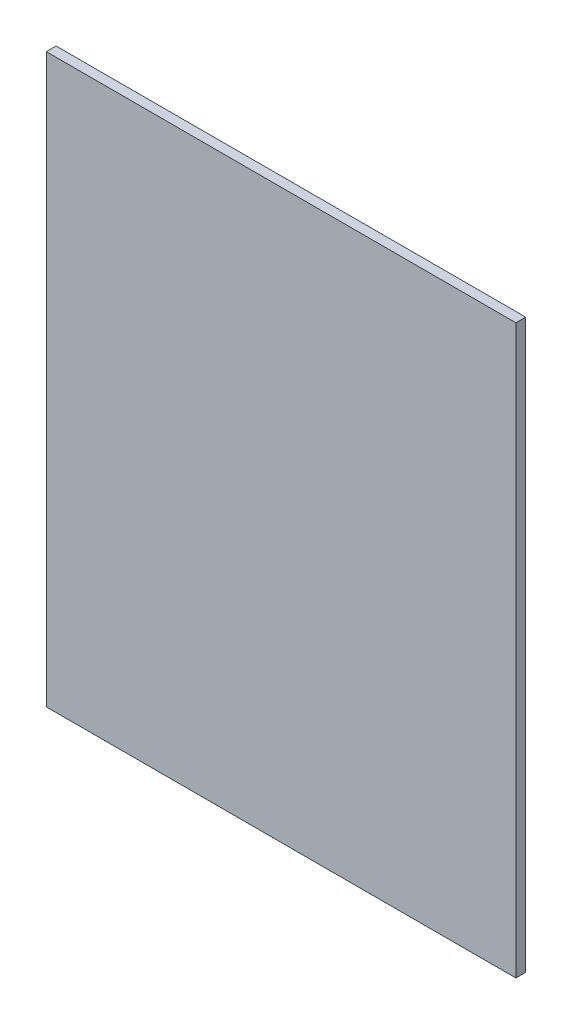
ISO-10303-21;
HEADER;
FILE_DESCRIPTION(('STEP AP214'),'2;1');
FILE_NAME('part.step','',(''),(''),'','','');
FILE_SCHEMA(('AUTOMOTIVE_DESIGN { 1 0 10303 214 1 1 1 1 }'));
ENDSEC;
DATA;
#1=APPLICATION_CONTEXT('core data for automotive mechanical design processes');
#2=APPLICATION_PROTOCOL_DEFINITION('international standard','automotive_design',2000,#1);
#3=PRODUCT_CONTEXT('',#1,'mechanical');
#4=PRODUCT('Part','Part','',(#3));
#5=PRODUCT_RELATED_PRODUCT_CATEGORY('part','',(#4));
#6=PRODUCT_DEFINITION_FORMATION('','',#4);
#7=PRODUCT_DEFINITION_CONTEXT('part definition',#1,'design');
#8=PRODUCT_DEFINITION('design','',#6,#7);
#9=PRODUCT_DEFINITION_SHAPE('','',#8);
#10=(LENGTH_UNIT() NAMED_UNIT(*) SI_UNIT(.MILLI.,.METRE.));
#11=(NAMED_UNIT(*) PLANE_ANGLE_UNIT() SI_UNIT($,.RADIAN.));
#12=(NAMED_UNIT(*) SI_UNIT($,.STERADIAN.) SOLID_ANGLE_UNIT());
#13=UNCERTAINTY_MEASURE_WITH_UNIT(LENGTH_MEASURE(1.E-05),#10,'distance_accuracy_value','');
#14=(GEOMETRIC_REPRESENTATION_CONTEXT(3) GLOBAL_UNCERTAINTY_ASSIGNED_CONTEXT((#13)) GLOBAL_UNIT_ASSIGNED_CONTEXT((#10,
#11,#12)) REPRESENTATION_CONTEXT('',''));
#15=CARTESIAN_POINT('',(0.,0.,0.));
#16=DIRECTION('',(0.,0.,1.));
#17=DIRECTION('',(1.,0.,0.));
#18=AXIS2_PLACEMENT_3D('',#15,#16,#17);
#19=CARTESIAN_POINT('',(0.,0.,0.01));
#20=DIRECTION('',(0.,0.,1.));
#21=DIRECTION('',(1.,0.,0.));
#22=AXIS2_PLACEMENT_3D('',#19,#20,#21);
#23=PLANE('',#22);
#24=DIRECTION('',(0.,-1.,0.));
#25=VECTOR('',#24,1.);
#26=CARTESIAN_POINT('',(-0.24,0.29,0.01));
#27=LINE('',#26,#25);
#28=CARTESIAN_POINT('',(-0.24,0.29,0.01));
#29=VERTEX_POINT('',#28);
#30=CARTESIAN_POINT('',(-0.24,-0.29,0.01));
#31=VERTEX_POINT('',#30);
#32=EDGE_CURVE('E90',#29,#31,#27,.T.);
#33=ORIENTED_EDGE('',*,*,#32,.T.);
#34=DIRECTION('',(1.,0.,0.));
#35=VECTOR('',#34,1.);
#36=CARTESIAN_POINT('',(-0.24,-0.29,0.01));
#37=LINE('',#36,#35);
#38=CARTESIAN_POINT('',(0.24,-0.29,0.01));
#39=VERTEX_POINT('',#38);
#40=EDGE_CURVE('E97',#31,#39,#37,.T.);
#41=ORIENTED_EDGE('',*,*,#40,.T.);
#42=DIRECTION('',(0.,1.,0.));
#43=VECTOR('',#42,1.);
#44=CARTESIAN_POINT('',(0.24,-0.29,0.01));
#45=LINE('',#44,#43);
#46=CARTESIAN_POINT('',(0.24,0.29,0.01));
#47=VERTEX_POINT('',#46);
#48=EDGE_CURVE('E74',#39,#47,#45,.T.);
#49=ORIENTED_EDGE('',*,*,#48,.T.);
#50=DIRECTION('',(-1.,0.,0.));
#51=VECTOR('',#50,1.);
#52=CARTESIAN_POINT('',(0.24,0.29,0.01));
#53=LINE('',#52,#51);
#54=EDGE_CURVE('E11',#47,#29,#53,.T.);
#55=ORIENTED_EDGE('',*,*,#54,.T.);
#56=EDGE_LOOP('',(#33,#41,#49,#55));
#57=FACE_BOUND('',#56,.T.);
#58=ADVANCED_FACE('F17',(#57),#23,.T.);
#59=CARTESIAN_POINT('',(0.,0.,0.));
#60=DIRECTION('',(0.,0.,1.));
#61=DIRECTION('',(1.,0.,0.));
#62=AXIS2_PLACEMENT_3D('',#59,#60,#61);
#63=PLANE('',#62);
#64=DIRECTION('',(0.,-1.,0.));
#65=VECTOR('',#64,1.);
#66=CARTESIAN_POINT('',(-0.24,0.29,0.));
#67=LINE('',#66,#65);
#68=CARTESIAN_POINT('',(-0.24,0.29,0.));
#69=VERTEX_POINT('',#68);
#70=CARTESIAN_POINT('',(-0.24,-0.29,0.));
#71=VERTEX_POINT('',#70);
#72=EDGE_CURVE('E77',#69,#71,#67,.T.);
#73=ORIENTED_EDGE('',*,*,#72,.F.);
#74=DIRECTION('',(-1.,0.,0.));
#75=VECTOR('',#74,1.);
#76=CARTESIAN_POINT('',(0.24,0.29,0.));
#77=LINE('',#76,#75);
#78=CARTESIAN_POINT('',(0.24,0.29,0.));
#79=VERTEX_POINT('',#78);
#80=EDGE_CURVE('E26',#79,#69,#77,.T.);
#81=ORIENTED_EDGE('',*,*,#80,.F.);
#82=DIRECTION('',(0.,1.,0.));
#83=VECTOR('',#82,1.);
#84=CARTESIAN_POINT('',(0.24,-0.29,0.));
#85=LINE('',#84,#83);
#86=CARTESIAN_POINT('',(0.24,-0.29,0.));
#87=VERTEX_POINT('',#86);
#88=EDGE_CURVE('E101',#87,#79,#85,.T.);
#89=ORIENTED_EDGE('',*,*,#88,.F.);
#90=DIRECTION('',(1.,0.,0.));
#91=VECTOR('',#90,1.);
#92=CARTESIAN_POINT('',(-0.24,-0.29,0.));
#93=LINE('',#92,#91);
#94=EDGE_CURVE('E80',#71,#87,#93,.T.);
#95=ORIENTED_EDGE('',*,*,#94,.F.);
#96=EDGE_LOOP('',(#73,#81,#89,#95));
#97=FACE_BOUND('',#96,.T.);
#98=ADVANCED_FACE('F78',(#97),#63,.F.);
#99=CARTESIAN_POINT('',(0.24,0.29,0.));
#100=DIRECTION('',(0.,-1.,0.));
#101=DIRECTION('',(0.,0.,-1.));
#102=AXIS2_PLACEMENT_3D('',#99,#100,#101);
#103=PLANE('',#102);
#104=DIRECTION('',(0.,0.,1.));
#105=VECTOR('',#104,1.);
#106=CARTESIAN_POINT('',(0.24,0.29,0.));
#107=LINE('',#106,#105);
#108=EDGE_CURVE('E20',#79,#47,#107,.T.);
#109=ORIENTED_EDGE('',*,*,#108,.F.);
#110=ORIENTED_EDGE('',*,*,#80,.T.);
#111=DIRECTION('',(0.,0.,1.));
#112=VECTOR('',#111,1.);
#113=CARTESIAN_POINT('',(-0.24,0.29,0.));
#114=LINE('',#113,#112);
#115=EDGE_CURVE('E70',#69,#29,#114,.T.);
#116=ORIENTED_EDGE('',*,*,#115,.T.);
#117=ORIENTED_EDGE('',*,*,#54,.F.);
#118=EDGE_LOOP('',(#109,#110,#116,#117));
#119=FACE_BOUND('',#118,.T.);
#120=ADVANCED_FACE('F68',(#119),#103,.F.);
#121=CARTESIAN_POINT('',(0.24,-0.29,0.));
#122=DIRECTION('',(-1.,0.,0.));
#123=DIRECTION('',(0.,0.,1.));
#124=AXIS2_PLACEMENT_3D('',#121,#122,#123);
#125=PLANE('',#124);
#126=DIRECTION('',(0.,0.,1.));
#127=VECTOR('',#126,1.);
#128=CARTESIAN_POINT('',(0.24,-0.29,0.));
#129=LINE('',#128,#127);
#130=EDGE_CURVE('E102',#87,#39,#129,.T.);
#131=ORIENTED_EDGE('',*,*,#130,.F.);
#132=ORIENTED_EDGE('',*,*,#88,.T.);
#133=ORIENTED_EDGE('',*,*,#108,.T.);
#134=ORIENTED_EDGE('',*,*,#48,.F.);
#135=EDGE_LOOP('',(#131,#132,#133,#134));
#136=FACE_BOUND('',#135,.T.);
#137=ADVANCED_FACE('F118',(#136),#125,.F.);
#138=CARTESIAN_POINT('',(-0.24,-0.29,0.));
#139=DIRECTION('',(0.,1.,0.));
#140=DIRECTION('',(1.,0.,0.));
#141=AXIS2_PLACEMENT_3D('',#138,#139,#140);
#142=PLANE('',#141);
#143=DIRECTION('',(0.,0.,1.));
#144=VECTOR('',#143,1.);
#145=CARTESIAN_POINT('',(-0.24,-0.29,0.));
#146=LINE('',#145,#144);
#147=EDGE_CURVE('E85',#71,#31,#146,.T.);
#148=ORIENTED_EDGE('',*,*,#147,.F.);
#149=ORIENTED_EDGE('',*,*,#94,.T.);
#150=ORIENTED_EDGE('',*,*,#130,.T.);
#151=ORIENTED_EDGE('',*,*,#40,.F.);
#152=EDGE_LOOP('',(#148,#149,#150,#151));
#153=FACE_BOUND('',#152,.T.);
#154=ADVANCED_FACE('F121',(#153),#142,.F.);
#155=CARTESIAN_POINT('',(-0.24,0.29,0.));
#156=DIRECTION('',(1.,0.,0.));
#157=DIRECTION('',(0.,1.,0.));
#158=AXIS2_PLACEMENT_3D('',#155,#156,#157);
#159=PLANE('',#158);
#160=ORIENTED_EDGE('',*,*,#115,.F.);
#161=ORIENTED_EDGE('',*,*,#72,.T.);
#162=ORIENTED_EDGE('',*,*,#147,.T.);
#163=ORIENTED_EDGE('',*,*,#32,.F.);
#164=EDGE_LOOP('',(#160,#161,#162,#163));
#165=FACE_BOUND('',#164,.T.);
#166=ADVANCED_FACE('F88',(#165),#159,.F.);
#167=CLOSED_SHELL('',(#58,#98,#120,#137,#154,#166));
#168=MANIFOLD_SOLID_BREP('B1',#167);
#169=ADVANCED_BREP_SHAPE_REPRESENTATION('',(#18,#168),#14);
#170=SHAPE_DEFINITION_REPRESENTATION(#9,#169);
ENDSEC;
END-ISO-10303-21;
